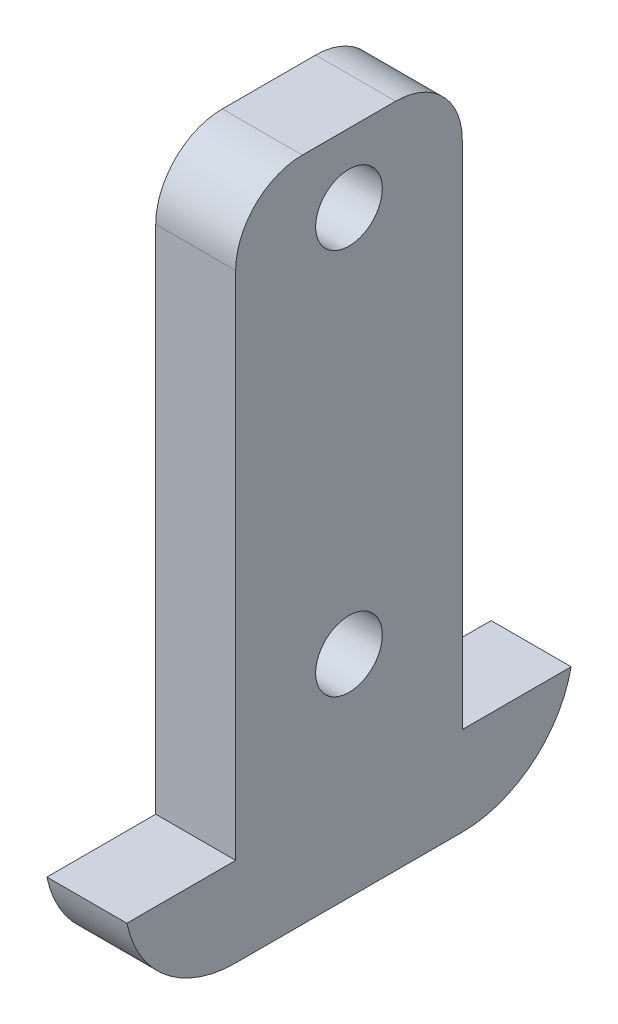
ISO-10303-21;
HEADER;
FILE_DESCRIPTION(('STEP AP214'),'2;1');
FILE_NAME('part.step','',(''),(''),'','','');
FILE_SCHEMA(('AUTOMOTIVE_DESIGN { 1 0 10303 214 1 1 1 1 }'));
ENDSEC;
DATA;
#1=APPLICATION_CONTEXT('core data for automotive mechanical design processes');
#2=APPLICATION_PROTOCOL_DEFINITION('international standard','automotive_design',2000,#1);
#3=PRODUCT_CONTEXT('',#1,'mechanical');
#4=PRODUCT('Part','Part','',(#3));
#5=PRODUCT_RELATED_PRODUCT_CATEGORY('part','',(#4));
#6=PRODUCT_DEFINITION_FORMATION('','',#4);
#7=PRODUCT_DEFINITION_CONTEXT('part definition',#1,'design');
#8=PRODUCT_DEFINITION('design','',#6,#7);
#9=PRODUCT_DEFINITION_SHAPE('','',#8);
#10=(LENGTH_UNIT() NAMED_UNIT(*) SI_UNIT(.MILLI.,.METRE.));
#11=(NAMED_UNIT(*) PLANE_ANGLE_UNIT() SI_UNIT($,.RADIAN.));
#12=(NAMED_UNIT(*) SI_UNIT($,.STERADIAN.) SOLID_ANGLE_UNIT());
#13=UNCERTAINTY_MEASURE_WITH_UNIT(LENGTH_MEASURE(1.E-05),#10,'distance_accuracy_value','');
#14=(GEOMETRIC_REPRESENTATION_CONTEXT(3) GLOBAL_UNCERTAINTY_ASSIGNED_CONTEXT((#13)) GLOBAL_UNIT_ASSIGNED_CONTEXT((#10,
#11,#12)) REPRESENTATION_CONTEXT('',''));
#15=CARTESIAN_POINT('',(0.,0.,0.));
#16=DIRECTION('',(0.,0.,1.));
#17=DIRECTION('',(1.,0.,0.));
#18=AXIS2_PLACEMENT_3D('',#15,#16,#17);
#19=CARTESIAN_POINT('',(3.6,0.,0.));
#20=DIRECTION('',(1.,0.,0.));
#21=DIRECTION('',(0.,0.,-1.));
#22=AXIS2_PLACEMENT_3D('',#19,#20,#21);
#23=PLANE('',#22);
#24=CARTESIAN_POINT('',(3.6,26.9,-10.));
#25=DIRECTION('',(1.,0.,0.));
#26=DIRECTION('',(0.,0.,-1.));
#27=AXIS2_PLACEMENT_3D('',#24,#25,#26);
#28=CIRCLE('',#27,1.5);
#29=CARTESIAN_POINT('',(3.6,26.9,-11.5));
#30=VERTEX_POINT('',#29);
#31=EDGE_CURVE('E229',#30,#30,#28,.T.);
#32=ORIENTED_EDGE('',*,*,#31,.F.);
#33=EDGE_LOOP('',(#32));
#34=FACE_BOUND('',#33,.T.);
#35=DIRECTION('',(0.,0.,1.));
#36=VECTOR('',#35,1.);
#37=CARTESIAN_POINT('',(3.6,4.,-4.9));
#38=LINE('',#37,#36);
#39=CARTESIAN_POINT('',(3.6,4.,-4.9));
#40=VERTEX_POINT('',#39);
#41=CARTESIAN_POINT('',(3.6,4.,0.));
#42=VERTEX_POINT('',#41);
#43=EDGE_CURVE('E208',#40,#42,#38,.T.);
#44=ORIENTED_EDGE('',*,*,#43,.T.);
#45=CARTESIAN_POINT('',(3.6,5.,-4.89897948556636));
#46=DIRECTION('',(1.,0.,0.));
#47=DIRECTION('',(0.,0.,-1.));
#48=AXIS2_PLACEMENT_3D('',#45,#46,#47);
#49=CIRCLE('',#48,5.);
#50=CARTESIAN_POINT('',(3.6,0.,-4.89897948556636));
#51=VERTEX_POINT('',#50);
#52=EDGE_CURVE('E11',#42,#51,#49,.T.);
#53=ORIENTED_EDGE('',*,*,#52,.T.);
#54=DIRECTION('',(0.,0.,-1.));
#55=VECTOR('',#54,1.);
#56=CARTESIAN_POINT('',(3.6,0.,0.));
#57=LINE('',#56,#55);
#58=CARTESIAN_POINT('',(3.6,0.,-15.1010205144336));
#59=VERTEX_POINT('',#58);
#60=EDGE_CURVE('E125',#51,#59,#57,.T.);
#61=ORIENTED_EDGE('',*,*,#60,.T.);
#62=CARTESIAN_POINT('',(3.6,5.,-15.1010205144336));
#63=DIRECTION('',(1.,0.,0.));
#64=DIRECTION('',(0.,0.,-1.));
#65=AXIS2_PLACEMENT_3D('',#62,#63,#64);
#66=CIRCLE('',#65,5.);
#67=CARTESIAN_POINT('',(3.6,4.,-20.));
#68=VERTEX_POINT('',#67);
#69=EDGE_CURVE('E54',#59,#68,#66,.T.);
#70=ORIENTED_EDGE('',*,*,#69,.T.);
#71=DIRECTION('',(0.,0.,1.));
#72=VECTOR('',#71,1.);
#73=CARTESIAN_POINT('',(3.6,4.,-20.));
#74=LINE('',#73,#72);
#75=CARTESIAN_POINT('',(3.6,4.,-15.1));
#76=VERTEX_POINT('',#75);
#77=EDGE_CURVE('E123',#68,#76,#74,.T.);
#78=ORIENTED_EDGE('',*,*,#77,.T.);
#79=DIRECTION('',(0.,1.,0.));
#80=VECTOR('',#79,1.);
#81=CARTESIAN_POINT('',(3.6,4.,-15.1));
#82=LINE('',#81,#80);
#83=CARTESIAN_POINT('',(3.6,27.,-15.1));
#84=VERTEX_POINT('',#83);
#85=EDGE_CURVE('E139',#76,#84,#82,.T.);
#86=ORIENTED_EDGE('',*,*,#85,.T.);
#87=CARTESIAN_POINT('',(3.6,27.,-12.1));
#88=DIRECTION('',(1.,0.,0.));
#89=DIRECTION('',(0.,0.,-1.));
#90=AXIS2_PLACEMENT_3D('',#87,#88,#89);
#91=CIRCLE('',#90,3.);
#92=CARTESIAN_POINT('',(3.6,30.,-12.1));
#93=VERTEX_POINT('',#92);
#94=EDGE_CURVE('E168',#84,#93,#91,.T.);
#95=ORIENTED_EDGE('',*,*,#94,.T.);
#96=DIRECTION('',(0.,0.,1.));
#97=VECTOR('',#96,1.);
#98=CARTESIAN_POINT('',(3.6,30.,-15.1));
#99=LINE('',#98,#97);
#100=CARTESIAN_POINT('',(3.6,30.,-7.9));
#101=VERTEX_POINT('',#100);
#102=EDGE_CURVE('E233',#93,#101,#99,.T.);
#103=ORIENTED_EDGE('',*,*,#102,.T.);
#104=CARTESIAN_POINT('',(3.6,27.,-7.9));
#105=DIRECTION('',(1.,0.,0.));
#106=DIRECTION('',(0.,0.,-1.));
#107=AXIS2_PLACEMENT_3D('',#104,#105,#106);
#108=CIRCLE('',#107,3.);
#109=CARTESIAN_POINT('',(3.6,27.,-4.9));
#110=VERTEX_POINT('',#109);
#111=EDGE_CURVE('E165',#101,#110,#108,.T.);
#112=ORIENTED_EDGE('',*,*,#111,.T.);
#113=DIRECTION('',(0.,-1.,0.));
#114=VECTOR('',#113,1.);
#115=CARTESIAN_POINT('',(3.6,30.,-4.9));
#116=LINE('',#115,#114);
#117=EDGE_CURVE('E212',#110,#40,#116,.T.);
#118=ORIENTED_EDGE('',*,*,#117,.T.);
#119=EDGE_LOOP('',(#44,#53,#61,#70,#78,#86,#95,#103,#112,#118));
#120=FACE_BOUND('',#119,.T.);
#121=CARTESIAN_POINT('',(3.6,9.5,-10.));
#122=DIRECTION('',(1.,0.,0.));
#123=DIRECTION('',(0.,0.,-1.));
#124=AXIS2_PLACEMENT_3D('',#121,#122,#123);
#125=CIRCLE('',#124,1.5);
#126=CARTESIAN_POINT('',(3.6,9.5,-11.5));
#127=VERTEX_POINT('',#126);
#128=EDGE_CURVE('E245',#127,#127,#125,.T.);
#129=ORIENTED_EDGE('',*,*,#128,.F.);
#130=EDGE_LOOP('',(#129));
#131=FACE_BOUND('',#130,.T.);
#132=ADVANCED_FACE('F45',(#34,#120,#131),#23,.T.);
#133=CARTESIAN_POINT('',(0.,0.,0.));
#134=DIRECTION('',(1.,0.,0.));
#135=DIRECTION('',(0.,0.,-1.));
#136=AXIS2_PLACEMENT_3D('',#133,#134,#135);
#137=PLANE('',#136);
#138=DIRECTION('',(0.,0.,-1.));
#139=VECTOR('',#138,1.);
#140=CARTESIAN_POINT('',(0.,0.,0.));
#141=LINE('',#140,#139);
#142=CARTESIAN_POINT('',(0.,0.,-4.89897948556636));
#143=VERTEX_POINT('',#142);
#144=CARTESIAN_POINT('',(0.,0.,-15.1010205144336));
#145=VERTEX_POINT('',#144);
#146=EDGE_CURVE('E192',#143,#145,#141,.T.);
#147=ORIENTED_EDGE('',*,*,#146,.F.);
#148=CARTESIAN_POINT('',(0.,5.,-4.89897948556636));
#149=DIRECTION('',(1.,0.,0.));
#150=DIRECTION('',(0.,0.,-1.));
#151=AXIS2_PLACEMENT_3D('',#148,#149,#150);
#152=CIRCLE('',#151,5.);
#153=CARTESIAN_POINT('',(0.,4.,0.));
#154=VERTEX_POINT('',#153);
#155=EDGE_CURVE('E129',#143,#154,#152,.F.);
#156=ORIENTED_EDGE('',*,*,#155,.T.);
#157=DIRECTION('',(0.,0.,1.));
#158=VECTOR('',#157,1.);
#159=CARTESIAN_POINT('',(0.,4.,-4.9));
#160=LINE('',#159,#158);
#161=CARTESIAN_POINT('',(0.,4.,-4.9));
#162=VERTEX_POINT('',#161);
#163=EDGE_CURVE('E191',#162,#154,#160,.T.);
#164=ORIENTED_EDGE('',*,*,#163,.F.);
#165=DIRECTION('',(0.,-1.,0.));
#166=VECTOR('',#165,1.);
#167=CARTESIAN_POINT('',(0.,30.,-4.9));
#168=LINE('',#167,#166);
#169=CARTESIAN_POINT('',(0.,27.,-4.9));
#170=VERTEX_POINT('',#169);
#171=EDGE_CURVE('E204',#170,#162,#168,.T.);
#172=ORIENTED_EDGE('',*,*,#171,.F.);
#173=CARTESIAN_POINT('',(0.,27.,-7.9));
#174=DIRECTION('',(1.,0.,0.));
#175=DIRECTION('',(0.,0.,-1.));
#176=AXIS2_PLACEMENT_3D('',#173,#174,#175);
#177=CIRCLE('',#176,3.);
#178=CARTESIAN_POINT('',(0.,30.,-7.9));
#179=VERTEX_POINT('',#178);
#180=EDGE_CURVE('E156',#170,#179,#177,.F.);
#181=ORIENTED_EDGE('',*,*,#180,.T.);
#182=DIRECTION('',(0.,0.,1.));
#183=VECTOR('',#182,1.);
#184=CARTESIAN_POINT('',(0.,30.,-15.1));
#185=LINE('',#184,#183);
#186=CARTESIAN_POINT('',(0.,30.,-12.1));
#187=VERTEX_POINT('',#186);
#188=EDGE_CURVE('E217',#187,#179,#185,.T.);
#189=ORIENTED_EDGE('',*,*,#188,.F.);
#190=CARTESIAN_POINT('',(0.,27.,-12.1));
#191=DIRECTION('',(1.,0.,0.));
#192=DIRECTION('',(0.,0.,-1.));
#193=AXIS2_PLACEMENT_3D('',#190,#191,#192);
#194=CIRCLE('',#193,3.);
#195=CARTESIAN_POINT('',(0.,27.,-15.1));
#196=VERTEX_POINT('',#195);
#197=EDGE_CURVE('E159',#187,#196,#194,.F.);
#198=ORIENTED_EDGE('',*,*,#197,.T.);
#199=DIRECTION('',(0.,1.,0.));
#200=VECTOR('',#199,1.);
#201=CARTESIAN_POINT('',(0.,4.,-15.1));
#202=LINE('',#201,#200);
#203=CARTESIAN_POINT('',(0.,4.,-15.1));
#204=VERTEX_POINT('',#203);
#205=EDGE_CURVE('E221',#204,#196,#202,.T.);
#206=ORIENTED_EDGE('',*,*,#205,.F.);
#207=DIRECTION('',(0.,0.,1.));
#208=VECTOR('',#207,1.);
#209=CARTESIAN_POINT('',(0.,4.,-20.));
#210=LINE('',#209,#208);
#211=CARTESIAN_POINT('',(0.,4.,-20.));
#212=VERTEX_POINT('',#211);
#213=EDGE_CURVE('E225',#212,#204,#210,.T.);
#214=ORIENTED_EDGE('',*,*,#213,.F.);
#215=CARTESIAN_POINT('',(0.,5.,-15.1010205144336));
#216=DIRECTION('',(1.,0.,0.));
#217=DIRECTION('',(0.,0.,-1.));
#218=AXIS2_PLACEMENT_3D('',#215,#216,#217);
#219=CIRCLE('',#218,5.);
#220=EDGE_CURVE('E141',#212,#145,#219,.F.);
#221=ORIENTED_EDGE('',*,*,#220,.T.);
#222=EDGE_LOOP('',(#147,#156,#164,#172,#181,#189,#198,#206,#214,#221));
#223=FACE_BOUND('',#222,.T.);
#224=CARTESIAN_POINT('',(0.,26.9,-10.));
#225=DIRECTION('',(1.,0.,0.));
#226=DIRECTION('',(0.,0.,-1.));
#227=AXIS2_PLACEMENT_3D('',#224,#225,#226);
#228=CIRCLE('',#227,1.5);
#229=CARTESIAN_POINT('',(0.,26.9,-11.5));
#230=VERTEX_POINT('',#229);
#231=EDGE_CURVE('E241',#230,#230,#228,.T.);
#232=ORIENTED_EDGE('',*,*,#231,.T.);
#233=EDGE_LOOP('',(#232));
#234=FACE_BOUND('',#233,.T.);
#235=CARTESIAN_POINT('',(0.,9.5,-10.));
#236=DIRECTION('',(1.,0.,0.));
#237=DIRECTION('',(0.,0.,-1.));
#238=AXIS2_PLACEMENT_3D('',#235,#236,#237);
#239=CIRCLE('',#238,1.5);
#240=CARTESIAN_POINT('',(0.,9.5,-11.5));
#241=VERTEX_POINT('',#240);
#242=EDGE_CURVE('E249',#241,#241,#239,.T.);
#243=ORIENTED_EDGE('',*,*,#242,.T.);
#244=EDGE_LOOP('',(#243));
#245=FACE_BOUND('',#244,.T.);
#246=ADVANCED_FACE('F188',(#223,#234,#245),#137,.F.);
#247=CARTESIAN_POINT('',(3.6,0.,0.));
#248=DIRECTION('',(0.,1.,0.));
#249=DIRECTION('',(0.,0.,1.));
#250=AXIS2_PLACEMENT_3D('',#247,#248,#249);
#251=PLANE('',#250);
#252=ORIENTED_EDGE('',*,*,#60,.F.);
#253=DIRECTION('',(-1.,0.,0.));
#254=VECTOR('',#253,1.);
#255=CARTESIAN_POINT('',(3.6,0.,-4.89897948556636));
#256=LINE('',#255,#254);
#257=EDGE_CURVE('E177',#51,#143,#256,.T.);
#258=ORIENTED_EDGE('',*,*,#257,.T.);
#259=ORIENTED_EDGE('',*,*,#146,.T.);
#260=DIRECTION('',(1.,0.,0.));
#261=VECTOR('',#260,1.);
#262=CARTESIAN_POINT('',(3.6,0.,-15.1010205144336));
#263=LINE('',#262,#261);
#264=EDGE_CURVE('E61',#145,#59,#263,.T.);
#265=ORIENTED_EDGE('',*,*,#264,.T.);
#266=EDGE_LOOP('',(#252,#258,#259,#265));
#267=FACE_BOUND('',#266,.T.);
#268=ADVANCED_FACE('F265',(#267),#251,.F.);
#269=CARTESIAN_POINT('',(3.6,4.,-20.));
#270=DIRECTION('',(0.,-1.,0.));
#271=DIRECTION('',(0.,0.,-1.));
#272=AXIS2_PLACEMENT_3D('',#269,#270,#271);
#273=PLANE('',#272);
#274=ORIENTED_EDGE('',*,*,#213,.T.);
#275=DIRECTION('',(-1.,0.,0.));
#276=VECTOR('',#275,1.);
#277=CARTESIAN_POINT('',(3.6,4.,-15.1));
#278=LINE('',#277,#276);
#279=EDGE_CURVE('E136',#76,#204,#278,.T.);
#280=ORIENTED_EDGE('',*,*,#279,.F.);
#281=ORIENTED_EDGE('',*,*,#77,.F.);
#282=DIRECTION('',(-1.,0.,0.));
#283=VECTOR('',#282,1.);
#284=CARTESIAN_POINT('',(3.6,4.,-20.));
#285=LINE('',#284,#283);
#286=EDGE_CURVE('E133',#68,#212,#285,.T.);
#287=ORIENTED_EDGE('',*,*,#286,.T.);
#288=EDGE_LOOP('',(#274,#280,#281,#287));
#289=FACE_BOUND('',#288,.T.);
#290=ADVANCED_FACE('F132',(#289),#273,.F.);
#291=CARTESIAN_POINT('',(3.6,4.,-15.1));
#292=DIRECTION('',(0.,0.,1.));
#293=DIRECTION('',(1.,0.,0.));
#294=AXIS2_PLACEMENT_3D('',#291,#292,#293);
#295=PLANE('',#294);
#296=ORIENTED_EDGE('',*,*,#205,.T.);
#297=DIRECTION('',(-1.,0.,0.));
#298=VECTOR('',#297,1.);
#299=CARTESIAN_POINT('',(3.6,27.,-15.1));
#300=LINE('',#299,#298);
#301=EDGE_CURVE('E162',#196,#84,#300,.F.);
#302=ORIENTED_EDGE('',*,*,#301,.T.);
#303=ORIENTED_EDGE('',*,*,#85,.F.);
#304=ORIENTED_EDGE('',*,*,#279,.T.);
#305=EDGE_LOOP('',(#296,#302,#303,#304));
#306=FACE_BOUND('',#305,.T.);
#307=ADVANCED_FACE('F281',(#306),#295,.F.);
#308=CARTESIAN_POINT('',(3.6,30.,-15.1));
#309=DIRECTION('',(0.,-1.,0.));
#310=DIRECTION('',(0.,0.,-1.));
#311=AXIS2_PLACEMENT_3D('',#308,#309,#310);
#312=PLANE('',#311);
#313=ORIENTED_EDGE('',*,*,#102,.F.);
#314=DIRECTION('',(-1.,0.,0.));
#315=VECTOR('',#314,1.);
#316=CARTESIAN_POINT('',(3.6,30.,-12.1));
#317=LINE('',#316,#315);
#318=EDGE_CURVE('E147',#93,#187,#317,.T.);
#319=ORIENTED_EDGE('',*,*,#318,.T.);
#320=ORIENTED_EDGE('',*,*,#188,.T.);
#321=DIRECTION('',(-1.,0.,0.));
#322=VECTOR('',#321,1.);
#323=CARTESIAN_POINT('',(3.6,30.,-7.9));
#324=LINE('',#323,#322);
#325=EDGE_CURVE('E143',#179,#101,#324,.F.);
#326=ORIENTED_EDGE('',*,*,#325,.T.);
#327=EDGE_LOOP('',(#313,#319,#320,#326));
#328=FACE_BOUND('',#327,.T.);
#329=ADVANCED_FACE('F277',(#328),#312,.F.);
#330=CARTESIAN_POINT('',(3.6,30.,-4.9));
#331=DIRECTION('',(0.,0.,-1.));
#332=DIRECTION('',(-1.,0.,0.));
#333=AXIS2_PLACEMENT_3D('',#330,#331,#332);
#334=PLANE('',#333);
#335=ORIENTED_EDGE('',*,*,#117,.F.);
#336=DIRECTION('',(-1.,0.,0.));
#337=VECTOR('',#336,1.);
#338=CARTESIAN_POINT('',(3.6,27.,-4.9));
#339=LINE('',#338,#337);
#340=EDGE_CURVE('E171',#110,#170,#339,.T.);
#341=ORIENTED_EDGE('',*,*,#340,.T.);
#342=ORIENTED_EDGE('',*,*,#171,.T.);
#343=DIRECTION('',(-1.,0.,0.));
#344=VECTOR('',#343,1.);
#345=CARTESIAN_POINT('',(3.6,4.,-4.9));
#346=LINE('',#345,#344);
#347=EDGE_CURVE('E149',#40,#162,#346,.T.);
#348=ORIENTED_EDGE('',*,*,#347,.F.);
#349=EDGE_LOOP('',(#335,#341,#342,#348));
#350=FACE_BOUND('',#349,.T.);
#351=ADVANCED_FACE('F274',(#350),#334,.F.);
#352=CARTESIAN_POINT('',(3.6,4.,-4.9));
#353=DIRECTION('',(0.,-1.,0.));
#354=DIRECTION('',(0.,0.,-1.));
#355=AXIS2_PLACEMENT_3D('',#352,#353,#354);
#356=PLANE('',#355);
#357=ORIENTED_EDGE('',*,*,#163,.T.);
#358=DIRECTION('',(-1.,0.,0.));
#359=VECTOR('',#358,1.);
#360=CARTESIAN_POINT('',(3.6,4.,0.));
#361=LINE('',#360,#359);
#362=EDGE_CURVE('E201',#42,#154,#361,.T.);
#363=ORIENTED_EDGE('',*,*,#362,.F.);
#364=ORIENTED_EDGE('',*,*,#43,.F.);
#365=ORIENTED_EDGE('',*,*,#347,.T.);
#366=EDGE_LOOP('',(#357,#363,#364,#365));
#367=FACE_BOUND('',#366,.T.);
#368=ADVANCED_FACE('F199',(#367),#356,.F.);
#369=CARTESIAN_POINT('',(3.6,26.9,-10.));
#370=DIRECTION('',(-1.,0.,0.));
#371=DIRECTION('',(0.,0.,1.));
#372=AXIS2_PLACEMENT_3D('',#369,#370,#371);
#373=CYLINDRICAL_SURFACE('',#372,1.5);
#374=ORIENTED_EDGE('',*,*,#31,.T.);
#375=EDGE_LOOP('',(#374));
#376=FACE_BOUND('',#375,.T.);
#377=ORIENTED_EDGE('',*,*,#231,.F.);
#378=EDGE_LOOP('',(#377));
#379=FACE_BOUND('',#378,.T.);
#380=ADVANCED_FACE('F269',(#376,#379),#373,.F.);
#381=CARTESIAN_POINT('',(3.6,9.5,-10.));
#382=DIRECTION('',(-1.,0.,0.));
#383=DIRECTION('',(0.,0.,1.));
#384=AXIS2_PLACEMENT_3D('',#381,#382,#383);
#385=CYLINDRICAL_SURFACE('',#384,1.5);
#386=ORIENTED_EDGE('',*,*,#128,.T.);
#387=EDGE_LOOP('',(#386));
#388=FACE_BOUND('',#387,.T.);
#389=ORIENTED_EDGE('',*,*,#242,.F.);
#390=EDGE_LOOP('',(#389));
#391=FACE_BOUND('',#390,.T.);
#392=ADVANCED_FACE('F257',(#388,#391),#385,.F.);
#393=CARTESIAN_POINT('',(3.6,27.,-12.1));
#394=DIRECTION('',(-1.,0.,0.));
#395=DIRECTION('',(0.,0.,1.));
#396=AXIS2_PLACEMENT_3D('',#393,#394,#395);
#397=CYLINDRICAL_SURFACE('',#396,3.);
#398=ORIENTED_EDGE('',*,*,#94,.F.);
#399=ORIENTED_EDGE('',*,*,#301,.F.);
#400=ORIENTED_EDGE('',*,*,#197,.F.);
#401=ORIENTED_EDGE('',*,*,#318,.F.);
#402=EDGE_LOOP('',(#398,#399,#400,#401));
#403=FACE_BOUND('',#402,.T.);
#404=ADVANCED_FACE('F290',(#403),#397,.T.);
#405=CARTESIAN_POINT('',(3.6,27.,-7.9));
#406=DIRECTION('',(-1.,0.,0.));
#407=DIRECTION('',(0.,0.,1.));
#408=AXIS2_PLACEMENT_3D('',#405,#406,#407);
#409=CYLINDRICAL_SURFACE('',#408,3.);
#410=ORIENTED_EDGE('',*,*,#111,.F.);
#411=ORIENTED_EDGE('',*,*,#325,.F.);
#412=ORIENTED_EDGE('',*,*,#180,.F.);
#413=ORIENTED_EDGE('',*,*,#340,.F.);
#414=EDGE_LOOP('',(#410,#411,#412,#413));
#415=FACE_BOUND('',#414,.T.);
#416=ADVANCED_FACE('F293',(#415),#409,.T.);
#417=CARTESIAN_POINT('',(3.6,5.,-4.89897948556636));
#418=DIRECTION('',(-1.,0.,0.));
#419=DIRECTION('',(0.,0.,1.));
#420=AXIS2_PLACEMENT_3D('',#417,#418,#419);
#421=CYLINDRICAL_SURFACE('',#420,5.);
#422=ORIENTED_EDGE('',*,*,#52,.F.);
#423=ORIENTED_EDGE('',*,*,#362,.T.);
#424=ORIENTED_EDGE('',*,*,#155,.F.);
#425=ORIENTED_EDGE('',*,*,#257,.F.);
#426=EDGE_LOOP('',(#422,#423,#424,#425));
#427=FACE_BOUND('',#426,.T.);
#428=ADVANCED_FACE('F206',(#427),#421,.T.);
#429=CARTESIAN_POINT('',(3.6,5.,-15.1010205144336));
#430=DIRECTION('',(1.,0.,0.));
#431=DIRECTION('',(0.,0.,-1.));
#432=AXIS2_PLACEMENT_3D('',#429,#430,#431);
#433=CYLINDRICAL_SURFACE('',#432,5.);
#434=ORIENTED_EDGE('',*,*,#69,.F.);
#435=ORIENTED_EDGE('',*,*,#264,.F.);
#436=ORIENTED_EDGE('',*,*,#220,.F.);
#437=ORIENTED_EDGE('',*,*,#286,.F.);
#438=EDGE_LOOP('',(#434,#435,#436,#437));
#439=FACE_BOUND('',#438,.T.);
#440=ADVANCED_FACE('F47',(#439),#433,.T.);
#441=CLOSED_SHELL('',(#132,#246,#268,#290,#307,#329,#351,#368,#380,#392,#404,#416,#428,#440));
#442=MANIFOLD_SOLID_BREP('B2',#441);
#443=ADVANCED_BREP_SHAPE_REPRESENTATION('',(#18,#442),#14);
#444=SHAPE_DEFINITION_REPRESENTATION(#9,#443);
ENDSEC;
END-ISO-10303-21;
